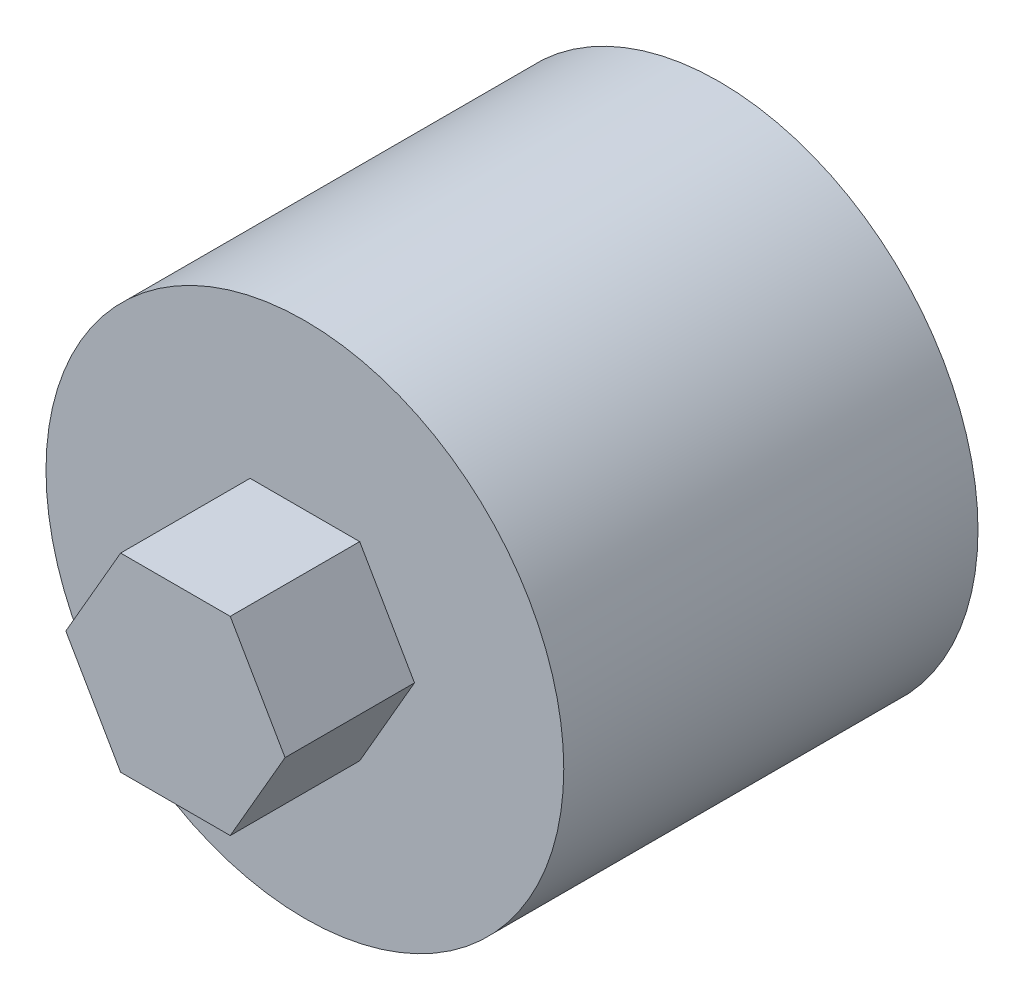
ISO-10303-21;
HEADER;
FILE_DESCRIPTION(('STEP AP214'),'2;1');
FILE_NAME('part.step','',(''),(''),'','','');
FILE_SCHEMA(('AUTOMOTIVE_DESIGN { 1 0 10303 214 1 1 1 1 }'));
ENDSEC;
DATA;
#1=APPLICATION_CONTEXT('core data for automotive mechanical design processes');
#2=APPLICATION_PROTOCOL_DEFINITION('international standard','automotive_design',2000,#1);
#3=PRODUCT_CONTEXT('',#1,'mechanical');
#4=PRODUCT('Part','Part','',(#3));
#5=PRODUCT_RELATED_PRODUCT_CATEGORY('part','',(#4));
#6=PRODUCT_DEFINITION_FORMATION('','',#4);
#7=PRODUCT_DEFINITION_CONTEXT('part definition',#1,'design');
#8=PRODUCT_DEFINITION('design','',#6,#7);
#9=PRODUCT_DEFINITION_SHAPE('','',#8);
#10=(LENGTH_UNIT() NAMED_UNIT(*) SI_UNIT(.MILLI.,.METRE.));
#11=(NAMED_UNIT(*) PLANE_ANGLE_UNIT() SI_UNIT($,.RADIAN.));
#12=(NAMED_UNIT(*) SI_UNIT($,.STERADIAN.) SOLID_ANGLE_UNIT());
#13=UNCERTAINTY_MEASURE_WITH_UNIT(LENGTH_MEASURE(1.E-05),#10,'distance_accuracy_value','');
#14=(GEOMETRIC_REPRESENTATION_CONTEXT(3) GLOBAL_UNCERTAINTY_ASSIGNED_CONTEXT((#13)) GLOBAL_UNIT_ASSIGNED_CONTEXT((#10,
#11,#12)) REPRESENTATION_CONTEXT('',''));
#15=CARTESIAN_POINT('',(0.,0.,0.));
#16=DIRECTION('',(0.,0.,1.));
#17=DIRECTION('',(1.,0.,0.));
#18=AXIS2_PLACEMENT_3D('',#15,#16,#17);
#19=CARTESIAN_POINT('',(0.,0.,4.8));
#20=DIRECTION('',(0.,0.,1.));
#21=DIRECTION('',(1.,0.,0.));
#22=AXIS2_PLACEMENT_3D('',#19,#20,#21);
#23=PLANE('',#22);
#24=CARTESIAN_POINT('',(0.,0.,4.8));
#25=DIRECTION('',(0.,0.,1.));
#26=DIRECTION('',(1.,0.,0.));
#27=AXIS2_PLACEMENT_3D('',#24,#25,#26);
#28=CIRCLE('',#27,3.);
#29=CARTESIAN_POINT('',(3.,0.,4.8));
#30=VERTEX_POINT('',#29);
#31=EDGE_CURVE('E51',#30,#30,#28,.T.);
#32=ORIENTED_EDGE('',*,*,#31,.T.);
#33=EDGE_LOOP('',(#32));
#34=FACE_BOUND('',#33,.T.);
#35=DIRECTION('',(-0.5,-0.866025403784438,0.));
#36=VECTOR('',#35,1.);
#37=CARTESIAN_POINT('',(0.952627944162883,-0.550000000000001,4.8));
#38=LINE('',#37,#36);
#39=CARTESIAN_POINT('',(1.27017059221718,0.,4.8));
#40=VERTEX_POINT('',#39);
#41=CARTESIAN_POINT('',(0.635085296108588,-1.1,4.8));
#42=VERTEX_POINT('',#41);
#43=EDGE_CURVE('E132',#40,#42,#38,.T.);
#44=ORIENTED_EDGE('',*,*,#43,.T.);
#45=DIRECTION('',(-1.,0.,0.));
#46=VECTOR('',#45,1.);
#47=CARTESIAN_POINT('',(0.,-1.1,4.8));
#48=LINE('',#47,#46);
#49=CARTESIAN_POINT('',(-0.635085296108589,-1.1,4.8));
#50=VERTEX_POINT('',#49);
#51=EDGE_CURVE('E66',#42,#50,#48,.T.);
#52=ORIENTED_EDGE('',*,*,#51,.T.);
#53=DIRECTION('',(-0.5,0.866025403784439,0.));
#54=VECTOR('',#53,1.);
#55=CARTESIAN_POINT('',(-0.952627944162883,-0.55,4.8));
#56=LINE('',#55,#54);
#57=CARTESIAN_POINT('',(-1.27017059221718,0.,4.8));
#58=VERTEX_POINT('',#57);
#59=EDGE_CURVE('E149',#50,#58,#56,.T.);
#60=ORIENTED_EDGE('',*,*,#59,.T.);
#61=DIRECTION('',(0.5,0.866025403784439,0.));
#62=VECTOR('',#61,1.);
#63=CARTESIAN_POINT('',(-0.952627944162883,0.55,4.8));
#64=LINE('',#63,#62);
#65=CARTESIAN_POINT('',(-0.635085296108588,1.1,4.8));
#66=VERTEX_POINT('',#65);
#67=EDGE_CURVE('E152',#58,#66,#64,.T.);
#68=ORIENTED_EDGE('',*,*,#67,.T.);
#69=DIRECTION('',(1.,0.,0.));
#70=VECTOR('',#69,1.);
#71=CARTESIAN_POINT('',(0.,1.1,4.8));
#72=LINE('',#71,#70);
#73=CARTESIAN_POINT('',(0.635085296108589,1.1,4.8));
#74=VERTEX_POINT('',#73);
#75=EDGE_CURVE('E155',#66,#74,#72,.T.);
#76=ORIENTED_EDGE('',*,*,#75,.T.);
#77=DIRECTION('',(0.5,-0.866025403784439,0.));
#78=VECTOR('',#77,1.);
#79=CARTESIAN_POINT('',(0.952627944162883,0.55,4.8));
#80=LINE('',#79,#78);
#81=EDGE_CURVE('E158',#74,#40,#80,.T.);
#82=ORIENTED_EDGE('',*,*,#81,.T.);
#83=EDGE_LOOP('',(#44,#52,#60,#68,#76,#82));
#84=FACE_BOUND('',#83,.T.);
#85=ADVANCED_FACE('F43',(#34,#84),#23,.T.);
#86=CARTESIAN_POINT('',(0.,0.,0.));
#87=DIRECTION('',(0.,0.,1.));
#88=DIRECTION('',(1.,0.,0.));
#89=AXIS2_PLACEMENT_3D('',#86,#87,#88);
#90=PLANE('',#89);
#91=DIRECTION('',(0.,-1.,0.));
#92=VECTOR('',#91,1.);
#93=CARTESIAN_POINT('',(-1.1,0.,0.));
#94=LINE('',#93,#92);
#95=CARTESIAN_POINT('',(-1.1,1.09201648339208,0.));
#96=VERTEX_POINT('',#95);
#97=CARTESIAN_POINT('',(-1.1,-1.09201648339208,0.));
#98=VERTEX_POINT('',#97);
#99=EDGE_CURVE('E125',#96,#98,#94,.T.);
#100=ORIENTED_EDGE('',*,*,#99,.T.);
#101=CARTESIAN_POINT('',(0.,0.,0.));
#102=DIRECTION('',(0.,0.,-1.));
#103=DIRECTION('',(-1.,0.,0.));
#104=AXIS2_PLACEMENT_3D('',#101,#102,#103);
#105=CIRCLE('',#104,1.55);
#106=EDGE_CURVE('E58',#96,#98,#105,.T.);
#107=ORIENTED_EDGE('',*,*,#106,.F.);
#108=EDGE_LOOP('',(#100,#107));
#109=FACE_BOUND('',#108,.T.);
#110=CARTESIAN_POINT('',(0.,0.,0.));
#111=DIRECTION('',(0.,0.,1.));
#112=DIRECTION('',(1.,0.,0.));
#113=AXIS2_PLACEMENT_3D('',#110,#111,#112);
#114=CIRCLE('',#113,3.);
#115=CARTESIAN_POINT('',(3.,0.,0.));
#116=VERTEX_POINT('',#115);
#117=EDGE_CURVE('E13',#116,#116,#114,.T.);
#118=ORIENTED_EDGE('',*,*,#117,.F.);
#119=EDGE_LOOP('',(#118));
#120=FACE_BOUND('',#119,.T.);
#121=ADVANCED_FACE('F181',(#109,#120),#90,.F.);
#122=CARTESIAN_POINT('',(0.,0.,4.));
#123=DIRECTION('',(0.,0.,-1.));
#124=DIRECTION('',(-1.,0.,0.));
#125=AXIS2_PLACEMENT_3D('',#122,#123,#124);
#126=CYLINDRICAL_SURFACE('',#125,3.);
#127=ORIENTED_EDGE('',*,*,#31,.F.);
#128=EDGE_LOOP('',(#127));
#129=FACE_BOUND('',#128,.T.);
#130=ORIENTED_EDGE('',*,*,#117,.T.);
#131=EDGE_LOOP('',(#130));
#132=FACE_BOUND('',#131,.T.);
#133=ADVANCED_FACE('F45',(#129,#132),#126,.T.);
#134=CARTESIAN_POINT('',(0.,-1.1,6.3));
#135=DIRECTION('',(0.,-1.,0.));
#136=DIRECTION('',(1.,0.,0.));
#137=AXIS2_PLACEMENT_3D('',#134,#135,#136);
#138=PLANE('',#137);
#139=ORIENTED_EDGE('',*,*,#51,.F.);
#140=DIRECTION('',(0.,0.,-1.));
#141=VECTOR('',#140,1.);
#142=CARTESIAN_POINT('',(0.635085296108588,-1.1,6.3));
#143=LINE('',#142,#141);
#144=CARTESIAN_POINT('',(0.635085296108588,-1.1,6.3));
#145=VERTEX_POINT('',#144);
#146=EDGE_CURVE('E163',#145,#42,#143,.T.);
#147=ORIENTED_EDGE('',*,*,#146,.F.);
#148=DIRECTION('',(-1.,0.,0.));
#149=VECTOR('',#148,1.);
#150=CARTESIAN_POINT('',(0.,-1.1,6.3));
#151=LINE('',#150,#149);
#152=CARTESIAN_POINT('',(-0.635085296108589,-1.1,6.3));
#153=VERTEX_POINT('',#152);
#154=EDGE_CURVE('E128',#145,#153,#151,.T.);
#155=ORIENTED_EDGE('',*,*,#154,.T.);
#156=DIRECTION('',(0.,0.,-1.));
#157=VECTOR('',#156,1.);
#158=CARTESIAN_POINT('',(-0.635085296108589,-1.1,6.3));
#159=LINE('',#158,#157);
#160=EDGE_CURVE('E147',#153,#50,#159,.T.);
#161=ORIENTED_EDGE('',*,*,#160,.T.);
#162=EDGE_LOOP('',(#139,#147,#155,#161));
#163=FACE_BOUND('',#162,.T.);
#164=ADVANCED_FACE('F180',(#163),#138,.T.);
#165=CARTESIAN_POINT('',(0.952627944162883,-0.550000000000001,6.3));
#166=DIRECTION('',(0.866025403784438,-0.5,0.));
#167=DIRECTION('',(0.5,0.866025403784438,0.));
#168=AXIS2_PLACEMENT_3D('',#165,#166,#167);
#169=PLANE('',#168);
#170=ORIENTED_EDGE('',*,*,#43,.F.);
#171=DIRECTION('',(0.,0.,-1.));
#172=VECTOR('',#171,1.);
#173=CARTESIAN_POINT('',(1.27017059221718,0.,6.3));
#174=LINE('',#173,#172);
#175=CARTESIAN_POINT('',(1.27017059221718,0.,6.3));
#176=VERTEX_POINT('',#175);
#177=EDGE_CURVE('E165',#176,#40,#174,.T.);
#178=ORIENTED_EDGE('',*,*,#177,.F.);
#179=DIRECTION('',(-0.5,-0.866025403784438,0.));
#180=VECTOR('',#179,1.);
#181=CARTESIAN_POINT('',(0.952627944162883,-0.550000000000001,6.3));
#182=LINE('',#181,#180);
#183=EDGE_CURVE('E144',#176,#145,#182,.T.);
#184=ORIENTED_EDGE('',*,*,#183,.T.);
#185=ORIENTED_EDGE('',*,*,#146,.T.);
#186=EDGE_LOOP('',(#170,#178,#184,#185));
#187=FACE_BOUND('',#186,.T.);
#188=ADVANCED_FACE('F195',(#187),#169,.T.);
#189=CARTESIAN_POINT('',(0.952627944162883,0.55,6.3));
#190=DIRECTION('',(0.866025403784439,0.5,0.));
#191=DIRECTION('',(-0.5,0.866025403784439,0.));
#192=AXIS2_PLACEMENT_3D('',#189,#190,#191);
#193=PLANE('',#192);
#194=ORIENTED_EDGE('',*,*,#81,.F.);
#195=DIRECTION('',(0.,0.,-1.));
#196=VECTOR('',#195,1.);
#197=CARTESIAN_POINT('',(0.635085296108589,1.1,6.3));
#198=LINE('',#197,#196);
#199=CARTESIAN_POINT('',(0.635085296108589,1.1,6.3));
#200=VERTEX_POINT('',#199);
#201=EDGE_CURVE('E167',#200,#74,#198,.T.);
#202=ORIENTED_EDGE('',*,*,#201,.F.);
#203=DIRECTION('',(0.5,-0.866025403784439,0.));
#204=VECTOR('',#203,1.);
#205=CARTESIAN_POINT('',(0.952627944162883,0.55,6.3));
#206=LINE('',#205,#204);
#207=EDGE_CURVE('E141',#200,#176,#206,.T.);
#208=ORIENTED_EDGE('',*,*,#207,.T.);
#209=ORIENTED_EDGE('',*,*,#177,.T.);
#210=EDGE_LOOP('',(#194,#202,#208,#209));
#211=FACE_BOUND('',#210,.T.);
#212=ADVANCED_FACE('F208',(#211),#193,.T.);
#213=CARTESIAN_POINT('',(0.,1.1,6.3));
#214=DIRECTION('',(0.,1.,0.));
#215=DIRECTION('',(-1.,0.,0.));
#216=AXIS2_PLACEMENT_3D('',#213,#214,#215);
#217=PLANE('',#216);
#218=ORIENTED_EDGE('',*,*,#75,.F.);
#219=DIRECTION('',(0.,0.,-1.));
#220=VECTOR('',#219,1.);
#221=CARTESIAN_POINT('',(-0.635085296108588,1.1,6.3));
#222=LINE('',#221,#220);
#223=CARTESIAN_POINT('',(-0.635085296108588,1.1,6.3));
#224=VERTEX_POINT('',#223);
#225=EDGE_CURVE('E169',#224,#66,#222,.T.);
#226=ORIENTED_EDGE('',*,*,#225,.F.);
#227=DIRECTION('',(1.,0.,0.));
#228=VECTOR('',#227,1.);
#229=CARTESIAN_POINT('',(0.,1.1,6.3));
#230=LINE('',#229,#228);
#231=EDGE_CURVE('E138',#224,#200,#230,.T.);
#232=ORIENTED_EDGE('',*,*,#231,.T.);
#233=ORIENTED_EDGE('',*,*,#201,.T.);
#234=EDGE_LOOP('',(#218,#226,#232,#233));
#235=FACE_BOUND('',#234,.T.);
#236=ADVANCED_FACE('F204',(#235),#217,.T.);
#237=CARTESIAN_POINT('',(-0.952627944162883,0.55,6.3));
#238=DIRECTION('',(-0.866025403784438,0.5,0.));
#239=DIRECTION('',(-0.5,-0.866025403784439,0.));
#240=AXIS2_PLACEMENT_3D('',#237,#238,#239);
#241=PLANE('',#240);
#242=ORIENTED_EDGE('',*,*,#67,.F.);
#243=DIRECTION('',(0.,0.,-1.));
#244=VECTOR('',#243,1.);
#245=CARTESIAN_POINT('',(-1.27017059221718,0.,6.3));
#246=LINE('',#245,#244);
#247=CARTESIAN_POINT('',(-1.27017059221718,0.,6.3));
#248=VERTEX_POINT('',#247);
#249=EDGE_CURVE('E171',#248,#58,#246,.T.);
#250=ORIENTED_EDGE('',*,*,#249,.F.);
#251=DIRECTION('',(0.5,0.866025403784439,0.));
#252=VECTOR('',#251,1.);
#253=CARTESIAN_POINT('',(-0.952627944162883,0.55,6.3));
#254=LINE('',#253,#252);
#255=EDGE_CURVE('E135',#248,#224,#254,.T.);
#256=ORIENTED_EDGE('',*,*,#255,.T.);
#257=ORIENTED_EDGE('',*,*,#225,.T.);
#258=EDGE_LOOP('',(#242,#250,#256,#257));
#259=FACE_BOUND('',#258,.T.);
#260=ADVANCED_FACE('F200',(#259),#241,.T.);
#261=CARTESIAN_POINT('',(-0.952627944162883,-0.55,6.3));
#262=DIRECTION('',(-0.866025403784439,-0.5,0.));
#263=DIRECTION('',(0.5,-0.866025403784439,0.));
#264=AXIS2_PLACEMENT_3D('',#261,#262,#263);
#265=PLANE('',#264);
#266=ORIENTED_EDGE('',*,*,#59,.F.);
#267=ORIENTED_EDGE('',*,*,#160,.F.);
#268=DIRECTION('',(-0.5,0.866025403784439,0.));
#269=VECTOR('',#268,1.);
#270=CARTESIAN_POINT('',(-0.952627944162883,-0.55,6.3));
#271=LINE('',#270,#269);
#272=EDGE_CURVE('E131',#153,#248,#271,.T.);
#273=ORIENTED_EDGE('',*,*,#272,.T.);
#274=ORIENTED_EDGE('',*,*,#249,.T.);
#275=EDGE_LOOP('',(#266,#267,#273,#274));
#276=FACE_BOUND('',#275,.T.);
#277=ADVANCED_FACE('F196',(#276),#265,.T.);
#278=CARTESIAN_POINT('',(0.,0.,6.3));
#279=DIRECTION('',(0.,0.,-1.));
#280=DIRECTION('',(-1.,0.,0.));
#281=AXIS2_PLACEMENT_3D('',#278,#279,#280);
#282=PLANE('',#281);
#283=ORIENTED_EDGE('',*,*,#154,.F.);
#284=ORIENTED_EDGE('',*,*,#183,.F.);
#285=ORIENTED_EDGE('',*,*,#207,.F.);
#286=ORIENTED_EDGE('',*,*,#231,.F.);
#287=ORIENTED_EDGE('',*,*,#255,.F.);
#288=ORIENTED_EDGE('',*,*,#272,.F.);
#289=EDGE_LOOP('',(#283,#284,#285,#286,#287,#288));
#290=FACE_BOUND('',#289,.T.);
#291=ADVANCED_FACE('F199',(#290),#282,.F.);
#292=CARTESIAN_POINT('',(0.,0.,3.8));
#293=DIRECTION('',(0.,0.,1.));
#294=DIRECTION('',(1.,0.,0.));
#295=AXIS2_PLACEMENT_3D('',#292,#293,#294);
#296=PLANE('',#295);
#297=CARTESIAN_POINT('',(0.,0.,3.8));
#298=DIRECTION('',(0.,0.,1.));
#299=DIRECTION('',(1.,0.,0.));
#300=AXIS2_PLACEMENT_3D('',#297,#298,#299);
#301=CIRCLE('',#300,1.55);
#302=CARTESIAN_POINT('',(-1.1,1.09201648339208,3.8));
#303=VERTEX_POINT('',#302);
#304=CARTESIAN_POINT('',(-1.1,-1.09201648339208,3.8));
#305=VERTEX_POINT('',#304);
#306=EDGE_CURVE('E119',#303,#305,#301,.F.);
#307=ORIENTED_EDGE('',*,*,#306,.T.);
#308=DIRECTION('',(0.,-1.,0.));
#309=VECTOR('',#308,1.);
#310=CARTESIAN_POINT('',(-1.1,0.,3.8));
#311=LINE('',#310,#309);
#312=EDGE_CURVE('E109',#303,#305,#311,.T.);
#313=ORIENTED_EDGE('',*,*,#312,.F.);
#314=EDGE_LOOP('',(#307,#313));
#315=FACE_BOUND('',#314,.T.);
#316=ADVANCED_FACE('F121',(#315),#296,.F.);
#317=CARTESIAN_POINT('',(0.,0.,8.87829621288106));
#318=DIRECTION('',(0.,0.,-1.));
#319=DIRECTION('',(-1.,0.,0.));
#320=AXIS2_PLACEMENT_3D('',#317,#318,#319);
#321=CYLINDRICAL_SURFACE('',#320,1.55);
#322=DIRECTION('',(0.,0.,-1.));
#323=VECTOR('',#322,1.);
#324=CARTESIAN_POINT('',(-1.1,1.09201648339208,8.87829621288106));
#325=LINE('',#324,#323);
#326=EDGE_CURVE('E114',#303,#96,#325,.T.);
#327=ORIENTED_EDGE('',*,*,#326,.T.);
#328=ORIENTED_EDGE('',*,*,#106,.T.);
#329=DIRECTION('',(0.,0.,-1.));
#330=VECTOR('',#329,1.);
#331=CARTESIAN_POINT('',(-1.1,-1.09201648339208,8.87829621288106));
#332=LINE('',#331,#330);
#333=EDGE_CURVE('E112',#305,#98,#332,.T.);
#334=ORIENTED_EDGE('',*,*,#333,.F.);
#335=ORIENTED_EDGE('',*,*,#306,.F.);
#336=EDGE_LOOP('',(#327,#328,#334,#335));
#337=FACE_BOUND('',#336,.T.);
#338=ADVANCED_FACE('F118',(#337),#321,.F.);
#339=CARTESIAN_POINT('',(-1.1,0.,8.87829621288106));
#340=DIRECTION('',(1.,0.,0.));
#341=DIRECTION('',(0.,0.,-1.));
#342=AXIS2_PLACEMENT_3D('',#339,#340,#341);
#343=PLANE('',#342);
#344=ORIENTED_EDGE('',*,*,#312,.T.);
#345=ORIENTED_EDGE('',*,*,#333,.T.);
#346=ORIENTED_EDGE('',*,*,#99,.F.);
#347=ORIENTED_EDGE('',*,*,#326,.F.);
#348=EDGE_LOOP('',(#344,#345,#346,#347));
#349=FACE_BOUND('',#348,.T.);
#350=ADVANCED_FACE('F110',(#349),#343,.T.);
#351=CLOSED_SHELL('',(#85,#121,#133,#164,#188,#212,#236,#260,#277,#291,#316,#338,#350));
#352=MANIFOLD_SOLID_BREP('B2',#351);
#353=ADVANCED_BREP_SHAPE_REPRESENTATION('',(#18,#352),#14);
#354=SHAPE_DEFINITION_REPRESENTATION(#9,#353);
ENDSEC;
END-ISO-10303-21;
